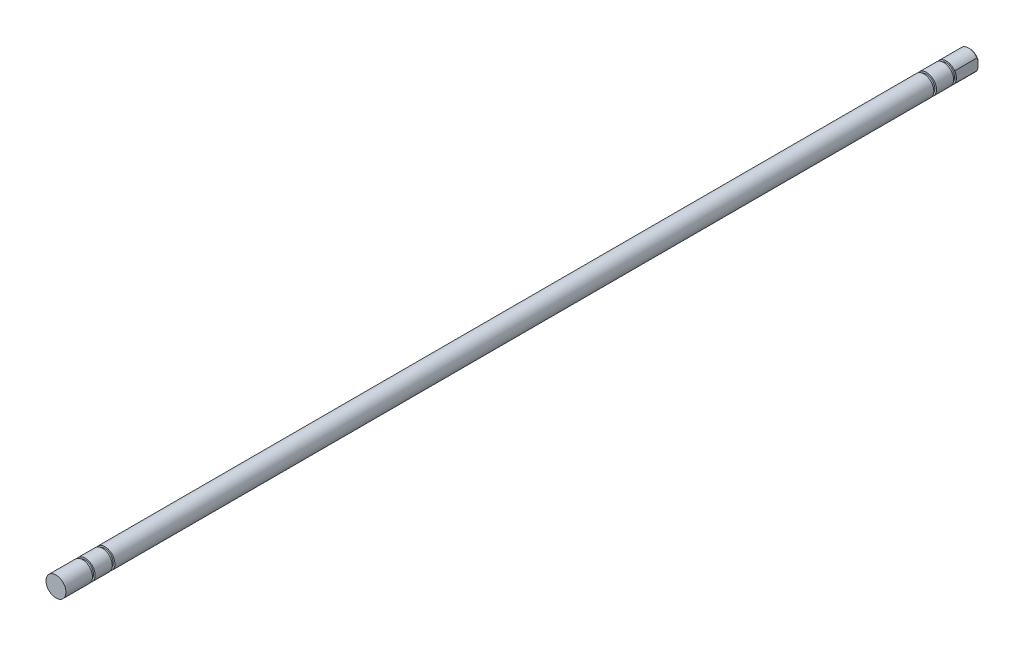
ISO-10303-21;
HEADER;
FILE_DESCRIPTION(('STEP AP214'),'2;1');
FILE_NAME('part.step','',(''),(''),'','','');
FILE_SCHEMA(('AUTOMOTIVE_DESIGN { 1 0 10303 214 1 1 1 1 }'));
ENDSEC;
DATA;
#1=APPLICATION_CONTEXT('core data for automotive mechanical design processes');
#2=APPLICATION_PROTOCOL_DEFINITION('international standard','automotive_design',2000,#1);
#3=PRODUCT_CONTEXT('',#1,'mechanical');
#4=PRODUCT('Part','Part','',(#3));
#5=PRODUCT_RELATED_PRODUCT_CATEGORY('part','',(#4));
#6=PRODUCT_DEFINITION_FORMATION('','',#4);
#7=PRODUCT_DEFINITION_CONTEXT('part definition',#1,'design');
#8=PRODUCT_DEFINITION('design','',#6,#7);
#9=PRODUCT_DEFINITION_SHAPE('','',#8);
#10=(LENGTH_UNIT() NAMED_UNIT(*) SI_UNIT(.MILLI.,.METRE.));
#11=(NAMED_UNIT(*) PLANE_ANGLE_UNIT() SI_UNIT($,.RADIAN.));
#12=(NAMED_UNIT(*) SI_UNIT($,.STERADIAN.) SOLID_ANGLE_UNIT());
#13=UNCERTAINTY_MEASURE_WITH_UNIT(LENGTH_MEASURE(1.E-05),#10,'distance_accuracy_value','');
#14=(GEOMETRIC_REPRESENTATION_CONTEXT(3) GLOBAL_UNCERTAINTY_ASSIGNED_CONTEXT((#13)) GLOBAL_UNIT_ASSIGNED_CONTEXT((#10,
#11,#12)) REPRESENTATION_CONTEXT('',''));
#15=CARTESIAN_POINT('',(0.,0.,0.));
#16=DIRECTION('',(0.,0.,1.));
#17=DIRECTION('',(1.,0.,0.));
#18=AXIS2_PLACEMENT_3D('',#15,#16,#17);
#19=CARTESIAN_POINT('',(0.,0.,0.));
#20=DIRECTION('',(0.,0.,1.));
#21=DIRECTION('',(1.,0.,0.));
#22=AXIS2_PLACEMENT_3D('',#19,#20,#21);
#23=PLANE('',#22);
#24=DIRECTION('',(0.,1.,0.));
#25=VECTOR('',#24,1.);
#26=CARTESIAN_POINT('',(-2.5,-3.00000000000001,0.));
#27=LINE('',#26,#25);
#28=CARTESIAN_POINT('',(-2.5,-1.01980390271865,0.));
#29=VERTEX_POINT('',#28);
#30=CARTESIAN_POINT('',(-2.5,1.01980390271865,0.));
#31=VERTEX_POINT('',#30);
#32=EDGE_CURVE('E130',#29,#31,#27,.T.);
#33=ORIENTED_EDGE('',*,*,#32,.T.);
#34=CARTESIAN_POINT('',(0.,0.,0.));
#35=DIRECTION('',(0.,0.,1.));
#36=DIRECTION('',(1.,0.,0.));
#37=AXIS2_PLACEMENT_3D('',#34,#35,#36);
#38=CIRCLE('',#37,2.70000000000004);
#39=CARTESIAN_POINT('',(2.5,1.01980390271865,0.));
#40=VERTEX_POINT('',#39);
#41=EDGE_CURVE('E67',#31,#40,#38,.F.);
#42=ORIENTED_EDGE('',*,*,#41,.T.);
#43=DIRECTION('',(0.,1.,0.));
#44=VECTOR('',#43,1.);
#45=CARTESIAN_POINT('',(2.5,-3.00000000000001,0.));
#46=LINE('',#45,#44);
#47=CARTESIAN_POINT('',(2.5,-1.01980390271865,0.));
#48=VERTEX_POINT('',#47);
#49=EDGE_CURVE('E126',#48,#40,#46,.T.);
#50=ORIENTED_EDGE('',*,*,#49,.F.);
#51=CARTESIAN_POINT('',(0.,0.,0.));
#52=DIRECTION('',(0.,0.,1.));
#53=DIRECTION('',(1.,0.,0.));
#54=AXIS2_PLACEMENT_3D('',#51,#52,#53);
#55=CIRCLE('',#54,2.70000000000004);
#56=EDGE_CURVE('E299',#48,#29,#55,.F.);
#57=ORIENTED_EDGE('',*,*,#56,.T.);
#58=EDGE_LOOP('',(#33,#42,#50,#57));
#59=FACE_BOUND('',#58,.T.);
#60=ADVANCED_FACE('F46',(#59),#23,.F.);
#61=CARTESIAN_POINT('',(0.,0.,275.));
#62=DIRECTION('',(0.,0.,-1.));
#63=DIRECTION('',(-1.,0.,0.));
#64=AXIS2_PLACEMENT_3D('',#61,#62,#63);
#65=CYLINDRICAL_SURFACE('',#64,3.);
#66=CARTESIAN_POINT('',(0.,0.,275.));
#67=DIRECTION('',(0.,0.,1.));
#68=DIRECTION('',(1.,0.,0.));
#69=AXIS2_PLACEMENT_3D('',#66,#67,#68);
#70=CIRCLE('',#69,3.);
#71=CARTESIAN_POINT('',(3.,0.,275.));
#72=VERTEX_POINT('',#71);
#73=EDGE_CURVE('E124',#72,#72,#70,.T.);
#74=ORIENTED_EDGE('',*,*,#73,.F.);
#75=EDGE_LOOP('',(#74));
#76=FACE_BOUND('',#75,.T.);
#77=CARTESIAN_POINT('',(0.,0.,267.));
#78=DIRECTION('',(0.,0.,1.));
#79=DIRECTION('',(1.,0.,0.));
#80=AXIS2_PLACEMENT_3D('',#77,#78,#79);
#81=CIRCLE('',#80,3.);
#82=CARTESIAN_POINT('',(3.,0.,267.));
#83=VERTEX_POINT('',#82);
#84=EDGE_CURVE('E133',#83,#83,#81,.T.);
#85=ORIENTED_EDGE('',*,*,#84,.T.);
#86=EDGE_LOOP('',(#85));
#87=FACE_BOUND('',#86,.T.);
#88=ADVANCED_FACE('F269',(#76,#87),#65,.T.);
#89=CARTESIAN_POINT('',(0.,0.,275.));
#90=DIRECTION('',(0.,0.,1.));
#91=DIRECTION('',(1.,0.,0.));
#92=AXIS2_PLACEMENT_3D('',#89,#90,#91);
#93=PLANE('',#92);
#94=ORIENTED_EDGE('',*,*,#73,.T.);
#95=EDGE_LOOP('',(#94));
#96=FACE_BOUND('',#95,.T.);
#97=ADVANCED_FACE('F228',(#96),#93,.T.);
#98=CARTESIAN_POINT('',(0.,3.,267.));
#99=DIRECTION('',(0.,0.,-1.));
#100=DIRECTION('',(-1.,0.,0.));
#101=AXIS2_PLACEMENT_3D('',#98,#99,#100);
#102=PLANE('',#101);
#103=CARTESIAN_POINT('',(0.,0.,267.));
#104=DIRECTION('',(0.,0.,1.));
#105=DIRECTION('',(1.,0.,0.));
#106=AXIS2_PLACEMENT_3D('',#103,#104,#105);
#107=CIRCLE('',#106,2.5);
#108=CARTESIAN_POINT('',(2.5,0.,267.));
#109=VERTEX_POINT('',#108);
#110=EDGE_CURVE('E144',#109,#109,#107,.T.);
#111=ORIENTED_EDGE('',*,*,#110,.T.);
#112=EDGE_LOOP('',(#111));
#113=FACE_BOUND('',#112,.T.);
#114=ORIENTED_EDGE('',*,*,#84,.F.);
#115=EDGE_LOOP('',(#114));
#116=FACE_BOUND('',#115,.T.);
#117=ADVANCED_FACE('F225',(#113,#116),#102,.T.);
#118=CARTESIAN_POINT('',(0.,0.,263.365004793515));
#119=DIRECTION('',(0.,0.,1.));
#120=DIRECTION('',(1.,0.,0.));
#121=AXIS2_PLACEMENT_3D('',#118,#119,#120);
#122=CYLINDRICAL_SURFACE('',#121,2.5);
#123=CARTESIAN_POINT('',(0.,0.,266.2));
#124=DIRECTION('',(0.,0.,1.));
#125=DIRECTION('',(1.,0.,0.));
#126=AXIS2_PLACEMENT_3D('',#123,#124,#125);
#127=CIRCLE('',#126,2.5);
#128=CARTESIAN_POINT('',(2.5,0.,266.2));
#129=VERTEX_POINT('',#128);
#130=EDGE_CURVE('E142',#129,#129,#127,.T.);
#131=ORIENTED_EDGE('',*,*,#130,.T.);
#132=EDGE_LOOP('',(#131));
#133=FACE_BOUND('',#132,.T.);
#134=ORIENTED_EDGE('',*,*,#110,.F.);
#135=EDGE_LOOP('',(#134));
#136=FACE_BOUND('',#135,.T.);
#137=ADVANCED_FACE('F217',(#133,#136),#122,.T.);
#138=CARTESIAN_POINT('',(0.,3.,266.2));
#139=DIRECTION('',(0.,0.,1.));
#140=DIRECTION('',(1.,0.,0.));
#141=AXIS2_PLACEMENT_3D('',#138,#139,#140);
#142=PLANE('',#141);
#143=CARTESIAN_POINT('',(0.,0.,266.2));
#144=DIRECTION('',(0.,0.,1.));
#145=DIRECTION('',(1.,0.,0.));
#146=AXIS2_PLACEMENT_3D('',#143,#144,#145);
#147=CIRCLE('',#146,3.);
#148=CARTESIAN_POINT('',(3.,0.,266.2));
#149=VERTEX_POINT('',#148);
#150=EDGE_CURVE('E140',#149,#149,#147,.T.);
#151=ORIENTED_EDGE('',*,*,#150,.T.);
#152=EDGE_LOOP('',(#151));
#153=FACE_BOUND('',#152,.T.);
#154=ORIENTED_EDGE('',*,*,#130,.F.);
#155=EDGE_LOOP('',(#154));
#156=FACE_BOUND('',#155,.T.);
#157=ADVANCED_FACE('F214',(#153,#156),#142,.T.);
#158=CARTESIAN_POINT('',(0.,0.,261.05));
#159=DIRECTION('',(0.,0.,1.));
#160=DIRECTION('',(1.,0.,0.));
#161=AXIS2_PLACEMENT_3D('',#158,#159,#160);
#162=CIRCLE('',#161,3.);
#163=CARTESIAN_POINT('',(3.,0.,261.05));
#164=VERTEX_POINT('',#163);
#165=EDGE_CURVE('E150',#164,#164,#162,.T.);
#166=ORIENTED_EDGE('',*,*,#165,.T.);
#167=EDGE_LOOP('',(#166));
#168=FACE_BOUND('',#167,.T.);
#169=ORIENTED_EDGE('',*,*,#150,.F.);
#170=EDGE_LOOP('',(#169));
#171=FACE_BOUND('',#170,.T.);
#172=ADVANCED_FACE('F220',(#168,#171),#65,.T.);
#173=CARTESIAN_POINT('',(0.,3.,261.05));
#174=DIRECTION('',(0.,0.,-1.));
#175=DIRECTION('',(-1.,0.,0.));
#176=AXIS2_PLACEMENT_3D('',#173,#174,#175);
#177=PLANE('',#176);
#178=CARTESIAN_POINT('',(0.,0.,261.05));
#179=DIRECTION('',(0.,0.,1.));
#180=DIRECTION('',(1.,0.,0.));
#181=AXIS2_PLACEMENT_3D('',#178,#179,#180);
#182=CIRCLE('',#181,2.5);
#183=CARTESIAN_POINT('',(2.5,0.,261.05));
#184=VERTEX_POINT('',#183);
#185=EDGE_CURVE('E139',#184,#184,#182,.T.);
#186=ORIENTED_EDGE('',*,*,#185,.T.);
#187=EDGE_LOOP('',(#186));
#188=FACE_BOUND('',#187,.T.);
#189=ORIENTED_EDGE('',*,*,#165,.F.);
#190=EDGE_LOOP('',(#189));
#191=FACE_BOUND('',#190,.T.);
#192=ADVANCED_FACE('F236',(#188,#191),#177,.T.);
#193=CARTESIAN_POINT('',(0.,0.,263.365004793515));
#194=DIRECTION('',(0.,0.,1.));
#195=DIRECTION('',(1.,0.,0.));
#196=AXIS2_PLACEMENT_3D('',#193,#194,#195);
#197=CYLINDRICAL_SURFACE('',#196,2.5);
#198=CARTESIAN_POINT('',(0.,0.,260.25));
#199=DIRECTION('',(0.,0.,1.));
#200=DIRECTION('',(1.,0.,0.));
#201=AXIS2_PLACEMENT_3D('',#198,#199,#200);
#202=CIRCLE('',#201,2.5);
#203=CARTESIAN_POINT('',(2.5,0.,260.25));
#204=VERTEX_POINT('',#203);
#205=EDGE_CURVE('E153',#204,#204,#202,.T.);
#206=ORIENTED_EDGE('',*,*,#205,.T.);
#207=EDGE_LOOP('',(#206));
#208=FACE_BOUND('',#207,.T.);
#209=ORIENTED_EDGE('',*,*,#185,.F.);
#210=EDGE_LOOP('',(#209));
#211=FACE_BOUND('',#210,.T.);
#212=ADVANCED_FACE('F235',(#208,#211),#197,.T.);
#213=CARTESIAN_POINT('',(0.,3.,260.25));
#214=DIRECTION('',(0.,0.,1.));
#215=DIRECTION('',(1.,0.,0.));
#216=AXIS2_PLACEMENT_3D('',#213,#214,#215);
#217=PLANE('',#216);
#218=CARTESIAN_POINT('',(0.,0.,260.25));
#219=DIRECTION('',(0.,0.,1.));
#220=DIRECTION('',(1.,0.,0.));
#221=AXIS2_PLACEMENT_3D('',#218,#219,#220);
#222=CIRCLE('',#221,3.);
#223=CARTESIAN_POINT('',(3.,0.,260.25));
#224=VERTEX_POINT('',#223);
#225=EDGE_CURVE('E148',#224,#224,#222,.T.);
#226=ORIENTED_EDGE('',*,*,#225,.T.);
#227=EDGE_LOOP('',(#226));
#228=FACE_BOUND('',#227,.T.);
#229=ORIENTED_EDGE('',*,*,#205,.F.);
#230=EDGE_LOOP('',(#229));
#231=FACE_BOUND('',#230,.T.);
#232=ADVANCED_FACE('F226',(#228,#231),#217,.T.);
#233=CARTESIAN_POINT('',(0.,0.,13.8));
#234=DIRECTION('',(0.,0.,1.));
#235=DIRECTION('',(1.,0.,0.));
#236=AXIS2_PLACEMENT_3D('',#233,#234,#235);
#237=CIRCLE('',#236,3.);
#238=CARTESIAN_POINT('',(3.,0.,13.8));
#239=VERTEX_POINT('',#238);
#240=EDGE_CURVE('E156',#239,#239,#237,.T.);
#241=ORIENTED_EDGE('',*,*,#240,.T.);
#242=EDGE_LOOP('',(#241));
#243=FACE_BOUND('',#242,.T.);
#244=ORIENTED_EDGE('',*,*,#225,.F.);
#245=EDGE_LOOP('',(#244));
#246=FACE_BOUND('',#245,.T.);
#247=ADVANCED_FACE('F233',(#243,#246),#65,.T.);
#248=CARTESIAN_POINT('',(0.,3.,13.8));
#249=DIRECTION('',(0.,0.,-1.));
#250=DIRECTION('',(-1.,0.,0.));
#251=AXIS2_PLACEMENT_3D('',#248,#249,#250);
#252=PLANE('',#251);
#253=CARTESIAN_POINT('',(0.,0.,13.8));
#254=DIRECTION('',(0.,0.,1.));
#255=DIRECTION('',(1.,0.,0.));
#256=AXIS2_PLACEMENT_3D('',#253,#254,#255);
#257=CIRCLE('',#256,2.5);
#258=CARTESIAN_POINT('',(2.5,0.,13.8));
#259=VERTEX_POINT('',#258);
#260=EDGE_CURVE('E151',#259,#259,#257,.T.);
#261=ORIENTED_EDGE('',*,*,#260,.T.);
#262=EDGE_LOOP('',(#261));
#263=FACE_BOUND('',#262,.T.);
#264=ORIENTED_EDGE('',*,*,#240,.F.);
#265=EDGE_LOOP('',(#264));
#266=FACE_BOUND('',#265,.T.);
#267=ADVANCED_FACE('F248',(#263,#266),#252,.T.);
#268=CARTESIAN_POINT('',(0.,0.,263.365004793515));
#269=DIRECTION('',(0.,0.,1.));
#270=DIRECTION('',(1.,0.,0.));
#271=AXIS2_PLACEMENT_3D('',#268,#269,#270);
#272=CYLINDRICAL_SURFACE('',#271,2.5);
#273=CARTESIAN_POINT('',(0.,0.,13.));
#274=DIRECTION('',(0.,0.,1.));
#275=DIRECTION('',(1.,0.,0.));
#276=AXIS2_PLACEMENT_3D('',#273,#274,#275);
#277=CIRCLE('',#276,2.5);
#278=CARTESIAN_POINT('',(2.5,0.,13.));
#279=VERTEX_POINT('',#278);
#280=EDGE_CURVE('E168',#279,#279,#277,.T.);
#281=ORIENTED_EDGE('',*,*,#280,.T.);
#282=EDGE_LOOP('',(#281));
#283=FACE_BOUND('',#282,.T.);
#284=ORIENTED_EDGE('',*,*,#260,.F.);
#285=EDGE_LOOP('',(#284));
#286=FACE_BOUND('',#285,.T.);
#287=ADVANCED_FACE('F244',(#283,#286),#272,.T.);
#288=CARTESIAN_POINT('',(0.,3.,13.));
#289=DIRECTION('',(0.,0.,1.));
#290=DIRECTION('',(1.,0.,0.));
#291=AXIS2_PLACEMENT_3D('',#288,#289,#290);
#292=PLANE('',#291);
#293=CARTESIAN_POINT('',(0.,0.,13.));
#294=DIRECTION('',(0.,0.,1.));
#295=DIRECTION('',(1.,0.,0.));
#296=AXIS2_PLACEMENT_3D('',#293,#294,#295);
#297=CIRCLE('',#296,3.);
#298=CARTESIAN_POINT('',(3.,0.,13.));
#299=VERTEX_POINT('',#298);
#300=EDGE_CURVE('E162',#299,#299,#297,.T.);
#301=ORIENTED_EDGE('',*,*,#300,.T.);
#302=EDGE_LOOP('',(#301));
#303=FACE_BOUND('',#302,.T.);
#304=ORIENTED_EDGE('',*,*,#280,.F.);
#305=EDGE_LOOP('',(#304));
#306=FACE_BOUND('',#305,.T.);
#307=ADVANCED_FACE('F241',(#303,#306),#292,.T.);
#308=CARTESIAN_POINT('',(0.,0.,7.85000000000002));
#309=DIRECTION('',(0.,0.,1.));
#310=DIRECTION('',(1.,0.,0.));
#311=AXIS2_PLACEMENT_3D('',#308,#309,#310);
#312=CIRCLE('',#311,3.00000000000001);
#313=CARTESIAN_POINT('',(3.00000000000001,0.,7.85000000000002));
#314=VERTEX_POINT('',#313);
#315=EDGE_CURVE('E171',#314,#314,#312,.T.);
#316=ORIENTED_EDGE('',*,*,#315,.T.);
#317=EDGE_LOOP('',(#316));
#318=FACE_BOUND('',#317,.T.);
#319=ORIENTED_EDGE('',*,*,#300,.F.);
#320=EDGE_LOOP('',(#319));
#321=FACE_BOUND('',#320,.T.);
#322=ADVANCED_FACE('F242',(#318,#321),#65,.T.);
#323=CARTESIAN_POINT('',(0.,3.00000000000001,7.85000000000003));
#324=DIRECTION('',(0.,0.,-1.));
#325=DIRECTION('',(-1.,0.,0.));
#326=AXIS2_PLACEMENT_3D('',#323,#324,#325);
#327=PLANE('',#326);
#328=CARTESIAN_POINT('',(0.,0.,7.85000000000002));
#329=DIRECTION('',(0.,0.,1.));
#330=DIRECTION('',(1.,0.,0.));
#331=AXIS2_PLACEMENT_3D('',#328,#329,#330);
#332=CIRCLE('',#331,2.5);
#333=CARTESIAN_POINT('',(2.5,0.,7.85000000000002));
#334=VERTEX_POINT('',#333);
#335=EDGE_CURVE('E161',#334,#334,#332,.T.);
#336=ORIENTED_EDGE('',*,*,#335,.T.);
#337=EDGE_LOOP('',(#336));
#338=FACE_BOUND('',#337,.T.);
#339=ORIENTED_EDGE('',*,*,#315,.F.);
#340=EDGE_LOOP('',(#339));
#341=FACE_BOUND('',#340,.T.);
#342=ADVANCED_FACE('F261',(#338,#341),#327,.T.);
#343=CARTESIAN_POINT('',(0.,0.,263.365004793515));
#344=DIRECTION('',(0.,0.,1.));
#345=DIRECTION('',(1.,0.,0.));
#346=AXIS2_PLACEMENT_3D('',#343,#344,#345);
#347=CYLINDRICAL_SURFACE('',#346,2.5);
#348=CARTESIAN_POINT('',(0.,0.,7.05000000000006));
#349=DIRECTION('',(0.,0.,1.));
#350=DIRECTION('',(1.,0.,0.));
#351=AXIS2_PLACEMENT_3D('',#348,#349,#350);
#352=CIRCLE('',#351,2.5);
#353=CARTESIAN_POINT('',(2.5,0.,7.05000000000006));
#354=VERTEX_POINT('',#353);
#355=EDGE_CURVE('E180',#354,#354,#352,.T.);
#356=ORIENTED_EDGE('',*,*,#355,.T.);
#357=EDGE_LOOP('',(#356));
#358=FACE_BOUND('',#357,.T.);
#359=ORIENTED_EDGE('',*,*,#335,.F.);
#360=EDGE_LOOP('',(#359));
#361=FACE_BOUND('',#360,.T.);
#362=ADVANCED_FACE('F260',(#358,#361),#347,.T.);
#363=CARTESIAN_POINT('',(0.,3.00000000000001,7.05000000000004));
#364=DIRECTION('',(0.,0.,1.));
#365=DIRECTION('',(1.,0.,0.));
#366=AXIS2_PLACEMENT_3D('',#363,#364,#365);
#367=PLANE('',#366);
#368=CARTESIAN_POINT('',(0.,0.,7.05000000000006));
#369=DIRECTION('',(0.,0.,1.));
#370=DIRECTION('',(1.,0.,0.));
#371=AXIS2_PLACEMENT_3D('',#368,#369,#370);
#372=CIRCLE('',#371,3.00000000000001);
#373=CARTESIAN_POINT('',(3.00000000000001,0.,7.05000000000006));
#374=VERTEX_POINT('',#373);
#375=EDGE_CURVE('E172',#374,#374,#372,.T.);
#376=ORIENTED_EDGE('',*,*,#375,.T.);
#377=EDGE_LOOP('',(#376));
#378=FACE_BOUND('',#377,.T.);
#379=ORIENTED_EDGE('',*,*,#355,.F.);
#380=EDGE_LOOP('',(#379));
#381=FACE_BOUND('',#380,.T.);
#382=ADVANCED_FACE('F251',(#378,#381),#367,.T.);
#383=DIRECTION('',(0.,0.,-1.));
#384=VECTOR('',#383,1.);
#385=CARTESIAN_POINT('',(2.50000000000003,1.65831239517765,275.));
#386=LINE('',#385,#384);
#387=CARTESIAN_POINT('',(2.5,1.6583123951777,7.00000000000001));
#388=VERTEX_POINT('',#387);
#389=CARTESIAN_POINT('',(2.50000000000003,1.65831239517765,0.299999999999967));
#390=VERTEX_POINT('',#389);
#391=EDGE_CURVE('E188',#388,#390,#386,.T.);
#392=ORIENTED_EDGE('',*,*,#391,.T.);
#393=CARTESIAN_POINT('',(0.,0.,0.299999999999967));
#394=DIRECTION('',(0.,0.,1.));
#395=DIRECTION('',(1.,0.,0.));
#396=AXIS2_PLACEMENT_3D('',#393,#394,#395);
#397=CIRCLE('',#396,3.);
#398=CARTESIAN_POINT('',(-2.49999999999996,1.65831239517775,0.299999999999967));
#399=VERTEX_POINT('',#398);
#400=EDGE_CURVE('E112',#390,#399,#397,.T.);
#401=ORIENTED_EDGE('',*,*,#400,.T.);
#402=DIRECTION('',(0.,0.,-1.));
#403=VECTOR('',#402,1.);
#404=CARTESIAN_POINT('',(-2.49999999999996,1.65831239517775,275.));
#405=LINE('',#404,#403);
#406=CARTESIAN_POINT('',(-2.5,1.6583123951777,7.00000000000001));
#407=VERTEX_POINT('',#406);
#408=EDGE_CURVE('E106',#399,#407,#405,.F.);
#409=ORIENTED_EDGE('',*,*,#408,.T.);
#410=CARTESIAN_POINT('',(0.,0.,7.00000000000001));
#411=DIRECTION('',(0.,0.,1.));
#412=DIRECTION('',(1.,0.,0.));
#413=AXIS2_PLACEMENT_3D('',#410,#411,#412);
#414=CIRCLE('',#413,3.);
#415=CARTESIAN_POINT('',(-2.5,-1.6583123951777,7.00000000000001));
#416=VERTEX_POINT('',#415);
#417=EDGE_CURVE('E115',#407,#416,#414,.T.);
#418=ORIENTED_EDGE('',*,*,#417,.T.);
#419=DIRECTION('',(0.,0.,-1.));
#420=VECTOR('',#419,1.);
#421=CARTESIAN_POINT('',(-2.49999999999996,-1.65831239517775,275.));
#422=LINE('',#421,#420);
#423=CARTESIAN_POINT('',(-2.49999999999996,-1.65831239517775,0.299999999999967));
#424=VERTEX_POINT('',#423);
#425=EDGE_CURVE('E120',#416,#424,#422,.T.);
#426=ORIENTED_EDGE('',*,*,#425,.T.);
#427=CARTESIAN_POINT('',(0.,0.,0.299999999999967));
#428=DIRECTION('',(0.,0.,1.));
#429=DIRECTION('',(1.,0.,0.));
#430=AXIS2_PLACEMENT_3D('',#427,#428,#429);
#431=CIRCLE('',#430,3.);
#432=CARTESIAN_POINT('',(2.50000000000003,-1.65831239517765,0.299999999999967));
#433=VERTEX_POINT('',#432);
#434=EDGE_CURVE('E195',#424,#433,#431,.T.);
#435=ORIENTED_EDGE('',*,*,#434,.T.);
#436=DIRECTION('',(0.,0.,-1.));
#437=VECTOR('',#436,1.);
#438=CARTESIAN_POINT('',(2.50000000000003,-1.65831239517765,275.));
#439=LINE('',#438,#437);
#440=CARTESIAN_POINT('',(2.5,-1.6583123951777,7.00000000000001));
#441=VERTEX_POINT('',#440);
#442=EDGE_CURVE('E189',#433,#441,#439,.F.);
#443=ORIENTED_EDGE('',*,*,#442,.T.);
#444=CARTESIAN_POINT('',(0.,0.,7.00000000000001));
#445=DIRECTION('',(0.,0.,1.));
#446=DIRECTION('',(1.,0.,0.));
#447=AXIS2_PLACEMENT_3D('',#444,#445,#446);
#448=CIRCLE('',#447,3.);
#449=EDGE_CURVE('E184',#441,#388,#448,.T.);
#450=ORIENTED_EDGE('',*,*,#449,.T.);
#451=EDGE_LOOP('',(#392,#401,#409,#418,#426,#435,#443,#450));
#452=FACE_BOUND('',#451,.T.);
#453=ORIENTED_EDGE('',*,*,#375,.F.);
#454=EDGE_LOOP('',(#453));
#455=FACE_BOUND('',#454,.T.);
#456=ADVANCED_FACE('F107',(#452,#455),#65,.T.);
#457=CARTESIAN_POINT('',(-2.5,-3.00000000000001,0.));
#458=DIRECTION('',(1.,0.,0.));
#459=DIRECTION('',(0.,0.,-1.));
#460=AXIS2_PLACEMENT_3D('',#457,#458,#459);
#461=PLANE('',#460);
#462=ORIENTED_EDGE('',*,*,#408,.F.);
#463=CARTESIAN_POINT('',(-2.49999999999996,1.65831239517775,0.299999999999967));
#464=CARTESIAN_POINT('',(-2.49999999999999,1.60679084267115,0.271526069001821));
#465=CARTESIAN_POINT('',(-2.5,1.55487726744436,0.243745879618412));
#466=CARTESIAN_POINT('',(-2.5,1.45027468417271,0.189858346831339));
#467=CARTESIAN_POINT('',(-2.5,1.39758675535712,0.16374890484349));
#468=CARTESIAN_POINT('',(-2.5,1.2913006947277,0.113408457732789));
#469=CARTESIAN_POINT('',(-2.5,1.23770236669209,0.0891778639921353));
#470=CARTESIAN_POINT('',(-2.5,1.12950060855716,0.042878709981769));
#471=CARTESIAN_POINT('',(-2.5,1.07489597600176,0.0208129664038627));
#472=CARTESIAN_POINT('',(-2.5,1.01980390271865,0.));
#473=B_SPLINE_CURVE_WITH_KNOTS('',3,(#463,#464,#465,#466,#467,#468,#469,#470,#471,#472),
.UNSPECIFIED.,.F.,.F.,(4,2,2,2,4),(0.,0.176604202594333,0.352982036857899,0.529398381419894,
0.706041299526527),.UNSPECIFIED.);
#474=EDGE_CURVE('E204',#399,#31,#473,.T.);
#475=ORIENTED_EDGE('',*,*,#474,.T.);
#476=ORIENTED_EDGE('',*,*,#32,.F.);
#477=CARTESIAN_POINT('',(-2.5,-1.01980390271865,0.));
#478=CARTESIAN_POINT('',(-2.5,-1.07489597600177,0.0208129664038618));
#479=CARTESIAN_POINT('',(-2.5,-1.12950060855716,0.0428787099817685));
#480=CARTESIAN_POINT('',(-2.5,-1.23770236669209,0.0891778639921357));
#481=CARTESIAN_POINT('',(-2.5,-1.2913006947277,0.11340845773279));
#482=CARTESIAN_POINT('',(-2.5,-1.39758675535712,0.16374890484349));
#483=CARTESIAN_POINT('',(-2.5,-1.45027468417271,0.189858346831337));
#484=CARTESIAN_POINT('',(-2.5,-1.55487726744436,0.243745879618415));
#485=CARTESIAN_POINT('',(-2.5,-1.60679084267115,0.27152606900183));
#486=CARTESIAN_POINT('',(-2.5,-1.65831239517774,0.299999999999991));
#487=B_SPLINE_CURVE_WITH_KNOTS('',3,(#477,#478,#479,#480,#481,#482,#483,#484,#485,#486),
.UNSPECIFIED.,.F.,.F.,(4,2,2,2,4),(0.,0.176642918106633,0.353059262668629,0.529437096932196,
0.70604129952653),.UNSPECIFIED.);
#488=EDGE_CURVE('E196',#29,#424,#487,.T.);
#489=ORIENTED_EDGE('',*,*,#488,.T.);
#490=ORIENTED_EDGE('',*,*,#425,.F.);
#491=DIRECTION('',(0.,1.,0.));
#492=VECTOR('',#491,1.);
#493=CARTESIAN_POINT('',(-2.5,-3.00000000000001,7.));
#494=LINE('',#493,#492);
#495=EDGE_CURVE('E122',#416,#407,#494,.T.);
#496=ORIENTED_EDGE('',*,*,#495,.T.);
#497=EDGE_LOOP('',(#462,#475,#476,#489,#490,#496));
#498=FACE_BOUND('',#497,.T.);
#499=ADVANCED_FACE('F123',(#498),#461,.F.);
#500=CARTESIAN_POINT('',(-5.42528695047141,-3.00000000000001,7.));
#501=DIRECTION('',(0.,0.,1.));
#502=DIRECTION('',(1.,0.,0.));
#503=AXIS2_PLACEMENT_3D('',#500,#501,#502);
#504=PLANE('',#503);
#505=ORIENTED_EDGE('',*,*,#495,.F.);
#506=ORIENTED_EDGE('',*,*,#417,.F.);
#507=EDGE_LOOP('',(#505,#506));
#508=FACE_BOUND('',#507,.T.);
#509=ADVANCED_FACE('F119',(#508),#504,.F.);
#510=CARTESIAN_POINT('',(2.5,-3.00000000000001,0.));
#511=DIRECTION('',(-1.,0.,0.));
#512=DIRECTION('',(0.,0.,1.));
#513=AXIS2_PLACEMENT_3D('',#510,#511,#512);
#514=PLANE('',#513);
#515=ORIENTED_EDGE('',*,*,#49,.T.);
#516=CARTESIAN_POINT('',(2.5,1.01980390271865,0.));
#517=CARTESIAN_POINT('',(2.5,1.07489597600176,0.0208129664038592));
#518=CARTESIAN_POINT('',(2.5,1.12950060855715,0.0428787099817625));
#519=CARTESIAN_POINT('',(2.5,1.23770236669206,0.0891778639921225));
#520=CARTESIAN_POINT('',(2.5,1.29130069472766,0.113408457732773));
#521=CARTESIAN_POINT('',(2.5,1.39758675535707,0.163748904843465));
#522=CARTESIAN_POINT('',(2.5,1.45027468417265,0.189858346831308));
#523=CARTESIAN_POINT('',(2.5,1.55487726744429,0.243745879618377));
#524=CARTESIAN_POINT('',(2.5,1.60679084267107,0.271526069001788));
#525=CARTESIAN_POINT('',(2.5,1.65831239517766,0.299999999999943));
#526=B_SPLINE_CURVE_WITH_KNOTS('',3,(#516,#517,#518,#519,#520,#521,#522,#523,#524,#525),
.UNSPECIFIED.,.F.,.F.,(4,2,2,2,4),(0.,0.176642918106609,0.35305926266858,0.529437096932123,
0.706041299526433),.UNSPECIFIED.);
#527=EDGE_CURVE('E12',#40,#390,#526,.T.);
#528=ORIENTED_EDGE('',*,*,#527,.T.);
#529=ORIENTED_EDGE('',*,*,#391,.F.);
#530=DIRECTION('',(0.,1.,0.));
#531=VECTOR('',#530,1.);
#532=CARTESIAN_POINT('',(2.5,-3.00000000000001,7.));
#533=LINE('',#532,#531);
#534=EDGE_CURVE('E127',#441,#388,#533,.T.);
#535=ORIENTED_EDGE('',*,*,#534,.F.);
#536=ORIENTED_EDGE('',*,*,#442,.F.);
#537=CARTESIAN_POINT('',(2.50000000000003,-1.65831239517765,0.299999999999967));
#538=CARTESIAN_POINT('',(2.50000000000001,-1.60679084267107,0.271526069001797));
#539=CARTESIAN_POINT('',(2.5,-1.55487726744429,0.24374587961838));
#540=CARTESIAN_POINT('',(2.5,-1.45027468417265,0.189858346831307));
#541=CARTESIAN_POINT('',(2.5,-1.39758675535707,0.163748904843465));
#542=CARTESIAN_POINT('',(2.5,-1.29130069472766,0.113408457732774));
#543=CARTESIAN_POINT('',(2.5,-1.23770236669206,0.0891778639921234));
#544=CARTESIAN_POINT('',(2.5,-1.12950060855715,0.0428787099817626));
#545=CARTESIAN_POINT('',(2.5,-1.07489597600176,0.0208129664038587));
#546=CARTESIAN_POINT('',(2.5,-1.01980390271865,0.));
#547=B_SPLINE_CURVE_WITH_KNOTS('',3,(#537,#538,#539,#540,#541,#542,#543,#544,#545,#546),
.UNSPECIFIED.,.F.,.F.,(4,2,2,2,4),(0.,0.176604202594311,0.352982036857855,0.529398381419827,
0.706041299526436),.UNSPECIFIED.);
#548=EDGE_CURVE('E62',#433,#48,#547,.T.);
#549=ORIENTED_EDGE('',*,*,#548,.T.);
#550=EDGE_LOOP('',(#515,#528,#529,#535,#536,#549));
#551=FACE_BOUND('',#550,.T.);
#552=ADVANCED_FACE('F286',(#551),#514,.F.);
#553=CARTESIAN_POINT('',(2.5,-3.00000000000001,7.));
#554=DIRECTION('',(0.,0.,1.));
#555=DIRECTION('',(1.,0.,0.));
#556=AXIS2_PLACEMENT_3D('',#553,#554,#555);
#557=PLANE('',#556);
#558=ORIENTED_EDGE('',*,*,#534,.T.);
#559=ORIENTED_EDGE('',*,*,#449,.F.);
#560=EDGE_LOOP('',(#558,#559));
#561=FACE_BOUND('',#560,.T.);
#562=ADVANCED_FACE('F278',(#561),#557,.F.);
#563=CARTESIAN_POINT('',(0.,0.,0.299999999999967));
#564=DIRECTION('',(0.,0.,1.));
#565=DIRECTION('',(1.,0.,0.));
#566=AXIS2_PLACEMENT_3D('',#563,#564,#565);
#567=CONICAL_SURFACE('',#566,3.,0.785398163397443);
#568=ORIENTED_EDGE('',*,*,#527,.F.);
#569=ORIENTED_EDGE('',*,*,#41,.F.);
#570=ORIENTED_EDGE('',*,*,#474,.F.);
#571=ORIENTED_EDGE('',*,*,#400,.F.);
#572=EDGE_LOOP('',(#568,#569,#570,#571));
#573=FACE_BOUND('',#572,.T.);
#574=ADVANCED_FACE('F273',(#573),#567,.T.);
#575=CARTESIAN_POINT('',(0.,0.,0.299999999999967));
#576=DIRECTION('',(0.,0.,1.));
#577=DIRECTION('',(1.,0.,0.));
#578=AXIS2_PLACEMENT_3D('',#575,#576,#577);
#579=CONICAL_SURFACE('',#578,3.,0.785398163397443);
#580=ORIENTED_EDGE('',*,*,#488,.F.);
#581=ORIENTED_EDGE('',*,*,#56,.F.);
#582=ORIENTED_EDGE('',*,*,#548,.F.);
#583=ORIENTED_EDGE('',*,*,#434,.F.);
#584=EDGE_LOOP('',(#580,#581,#582,#583));
#585=FACE_BOUND('',#584,.T.);
#586=ADVANCED_FACE('F47',(#585),#579,.T.);
#587=CLOSED_SHELL('',(#60,#88,#97,#117,#137,#157,#172,#192,#212,#232,#247,#267,#287,#307,#322,
#342,#362,#382,#456,#499,#509,#552,#562,#574,#586));
#588=MANIFOLD_SOLID_BREP('B2',#587);
#589=ADVANCED_BREP_SHAPE_REPRESENTATION('',(#18,#588),#14);
#590=SHAPE_DEFINITION_REPRESENTATION(#9,#589);
ENDSEC;
END-ISO-10303-21;
